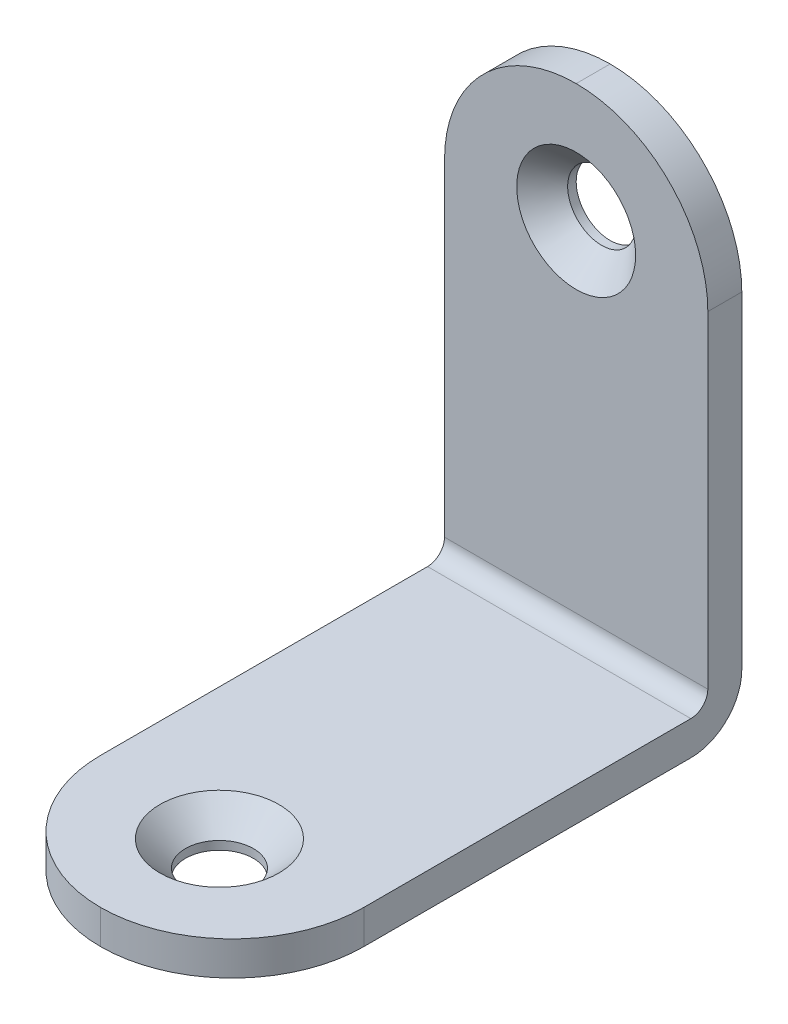
ISO-10303-21;
HEADER;
FILE_DESCRIPTION(('STEP AP214'),'2;1');
FILE_NAME('part.step','',(''),(''),'','','');
FILE_SCHEMA(('AUTOMOTIVE_DESIGN { 1 0 10303 214 1 1 1 1 }'));
ENDSEC;
DATA;
#1=APPLICATION_CONTEXT('core data for automotive mechanical design processes');
#2=APPLICATION_PROTOCOL_DEFINITION('international standard','automotive_design',2000,#1);
#3=PRODUCT_CONTEXT('',#1,'mechanical');
#4=PRODUCT('Part','Part','',(#3));
#5=PRODUCT_RELATED_PRODUCT_CATEGORY('part','',(#4));
#6=PRODUCT_DEFINITION_FORMATION('','',#4);
#7=PRODUCT_DEFINITION_CONTEXT('part definition',#1,'design');
#8=PRODUCT_DEFINITION('design','',#6,#7);
#9=PRODUCT_DEFINITION_SHAPE('','',#8);
#10=(LENGTH_UNIT() NAMED_UNIT(*) SI_UNIT(.MILLI.,.METRE.));
#11=(NAMED_UNIT(*) PLANE_ANGLE_UNIT() SI_UNIT($,.RADIAN.));
#12=(NAMED_UNIT(*) SI_UNIT($,.STERADIAN.) SOLID_ANGLE_UNIT());
#13=UNCERTAINTY_MEASURE_WITH_UNIT(LENGTH_MEASURE(1.E-05),#10,'distance_accuracy_value','');
#14=(GEOMETRIC_REPRESENTATION_CONTEXT(3) GLOBAL_UNCERTAINTY_ASSIGNED_CONTEXT((#13)) GLOBAL_UNIT_ASSIGNED_CONTEXT((#10,
#11,#12)) REPRESENTATION_CONTEXT('',''));
#15=CARTESIAN_POINT('',(0.,0.,0.));
#16=DIRECTION('',(0.,0.,1.));
#17=DIRECTION('',(1.,0.,0.));
#18=AXIS2_PLACEMENT_3D('',#15,#16,#17);
#19=CARTESIAN_POINT('',(-7.75,2.,30.));
#20=DIRECTION('',(0.,1.,0.));
#21=DIRECTION('',(0.,0.,1.));
#22=AXIS2_PLACEMENT_3D('',#19,#20,#21);
#23=PLANE('',#22);
#24=CARTESIAN_POINT('',(0.,2.,23.));
#25=DIRECTION('',(0.,1.,0.));
#26=DIRECTION('',(0.,0.,1.));
#27=AXIS2_PLACEMENT_3D('',#24,#25,#26);
#28=CIRCLE('',#27,3.50000000000001);
#29=CARTESIAN_POINT('',(0.,2.,26.5));
#30=VERTEX_POINT('',#29);
#31=EDGE_CURVE('E11',#30,#30,#28,.F.);
#32=ORIENTED_EDGE('',*,*,#31,.T.);
#33=EDGE_LOOP('',(#32));
#34=FACE_BOUND('',#33,.T.);
#35=CARTESIAN_POINT('',(0.,2.,22.25));
#36=DIRECTION('',(0.,1.,0.));
#37=DIRECTION('',(0.,0.,1.));
#38=AXIS2_PLACEMENT_3D('',#35,#36,#37);
#39=CIRCLE('',#38,7.75);
#40=CARTESIAN_POINT('',(-7.75,2.,22.25));
#41=VERTEX_POINT('',#40);
#42=CARTESIAN_POINT('',(0.,2.,30.));
#43=VERTEX_POINT('',#42);
#44=EDGE_CURVE('E50',#41,#43,#39,.T.);
#45=ORIENTED_EDGE('',*,*,#44,.T.);
#46=CARTESIAN_POINT('',(0.,2.,22.25));
#47=DIRECTION('',(0.,1.,0.));
#48=DIRECTION('',(0.,0.,1.));
#49=AXIS2_PLACEMENT_3D('',#46,#47,#48);
#50=CIRCLE('',#49,7.75);
#51=CARTESIAN_POINT('',(7.75,2.,22.25));
#52=VERTEX_POINT('',#51);
#53=EDGE_CURVE('E192',#43,#52,#50,.T.);
#54=ORIENTED_EDGE('',*,*,#53,.T.);
#55=DIRECTION('',(0.,0.,1.));
#56=VECTOR('',#55,1.);
#57=CARTESIAN_POINT('',(7.75,2.,30.));
#58=LINE('',#57,#56);
#59=CARTESIAN_POINT('',(7.75,2.,3.));
#60=VERTEX_POINT('',#59);
#61=EDGE_CURVE('E146',#60,#52,#58,.T.);
#62=ORIENTED_EDGE('',*,*,#61,.F.);
#63=DIRECTION('',(1.,0.,0.));
#64=VECTOR('',#63,1.);
#65=CARTESIAN_POINT('',(-7.75,2.,3.));
#66=LINE('',#65,#64);
#67=CARTESIAN_POINT('',(-7.75,2.,3.));
#68=VERTEX_POINT('',#67);
#69=EDGE_CURVE('E160',#68,#60,#66,.T.);
#70=ORIENTED_EDGE('',*,*,#69,.F.);
#71=DIRECTION('',(0.,0.,1.));
#72=VECTOR('',#71,1.);
#73=CARTESIAN_POINT('',(-7.75,2.,30.));
#74=LINE('',#73,#72);
#75=EDGE_CURVE('E134',#68,#41,#74,.T.);
#76=ORIENTED_EDGE('',*,*,#75,.T.);
#77=EDGE_LOOP('',(#45,#54,#62,#70,#76));
#78=FACE_BOUND('',#77,.T.);
#79=ADVANCED_FACE('F35',(#34,#78),#23,.T.);
#80=CARTESIAN_POINT('',(-7.75,3.,3.));
#81=DIRECTION('',(1.,0.,0.));
#82=DIRECTION('',(0.,0.,-1.));
#83=AXIS2_PLACEMENT_3D('',#80,#81,#82);
#84=CYLINDRICAL_SURFACE('',#83,1.);
#85=ORIENTED_EDGE('',*,*,#69,.T.);
#86=CARTESIAN_POINT('',(7.75,3.,3.));
#87=DIRECTION('',(-1.,0.,0.));
#88=DIRECTION('',(0.,0.,-1.));
#89=AXIS2_PLACEMENT_3D('',#86,#87,#88);
#90=CIRCLE('',#89,1.);
#91=CARTESIAN_POINT('',(7.75,3.,2.));
#92=VERTEX_POINT('',#91);
#93=EDGE_CURVE('E143',#92,#60,#90,.T.);
#94=ORIENTED_EDGE('',*,*,#93,.F.);
#95=DIRECTION('',(1.,0.,0.));
#96=VECTOR('',#95,1.);
#97=CARTESIAN_POINT('',(-7.75,3.,2.));
#98=LINE('',#97,#96);
#99=CARTESIAN_POINT('',(-7.75,3.,2.));
#100=VERTEX_POINT('',#99);
#101=EDGE_CURVE('E162',#100,#92,#98,.T.);
#102=ORIENTED_EDGE('',*,*,#101,.F.);
#103=CARTESIAN_POINT('',(-7.75,3.,3.));
#104=DIRECTION('',(-1.,0.,0.));
#105=DIRECTION('',(0.,0.,-1.));
#106=AXIS2_PLACEMENT_3D('',#103,#104,#105);
#107=CIRCLE('',#106,1.);
#108=EDGE_CURVE('E156',#100,#68,#107,.T.);
#109=ORIENTED_EDGE('',*,*,#108,.T.);
#110=EDGE_LOOP('',(#85,#94,#102,#109));
#111=FACE_BOUND('',#110,.T.);
#112=ADVANCED_FACE('F220',(#111),#84,.F.);
#113=CARTESIAN_POINT('',(-7.75,3.,2.));
#114=DIRECTION('',(0.,0.,1.));
#115=DIRECTION('',(0.,-1.,0.));
#116=AXIS2_PLACEMENT_3D('',#113,#114,#115);
#117=PLANE('',#116);
#118=CARTESIAN_POINT('',(0.,23.,2.));
#119=DIRECTION('',(0.,0.,1.));
#120=DIRECTION('',(0.,-1.,0.));
#121=AXIS2_PLACEMENT_3D('',#118,#119,#120);
#122=CIRCLE('',#121,3.50000000000001);
#123=CARTESIAN_POINT('',(0.,19.5,2.));
#124=VERTEX_POINT('',#123);
#125=EDGE_CURVE('E202',#124,#124,#122,.F.);
#126=ORIENTED_EDGE('',*,*,#125,.T.);
#127=EDGE_LOOP('',(#126));
#128=FACE_BOUND('',#127,.T.);
#129=DIRECTION('',(0.,-1.,0.));
#130=VECTOR('',#129,1.);
#131=CARTESIAN_POINT('',(7.75,3.,2.));
#132=LINE('',#131,#130);
#133=CARTESIAN_POINT('',(7.75,22.25,2.));
#134=VERTEX_POINT('',#133);
#135=EDGE_CURVE('E139',#134,#92,#132,.T.);
#136=ORIENTED_EDGE('',*,*,#135,.F.);
#137=CARTESIAN_POINT('',(0.,22.25,2.));
#138=DIRECTION('',(0.,0.,1.));
#139=DIRECTION('',(0.,-1.,0.));
#140=AXIS2_PLACEMENT_3D('',#137,#138,#139);
#141=CIRCLE('',#140,7.75);
#142=CARTESIAN_POINT('',(0.,30.,2.));
#143=VERTEX_POINT('',#142);
#144=EDGE_CURVE('E178',#134,#143,#141,.T.);
#145=ORIENTED_EDGE('',*,*,#144,.T.);
#146=CARTESIAN_POINT('',(0.,22.25,2.));
#147=DIRECTION('',(0.,0.,1.));
#148=DIRECTION('',(0.,-1.,0.));
#149=AXIS2_PLACEMENT_3D('',#146,#147,#148);
#150=CIRCLE('',#149,7.75);
#151=CARTESIAN_POINT('',(-7.75,22.25,2.));
#152=VERTEX_POINT('',#151);
#153=EDGE_CURVE('E176',#143,#152,#150,.T.);
#154=ORIENTED_EDGE('',*,*,#153,.T.);
#155=DIRECTION('',(0.,-1.,0.));
#156=VECTOR('',#155,1.);
#157=CARTESIAN_POINT('',(-7.75,3.,2.));
#158=LINE('',#157,#156);
#159=EDGE_CURVE('E154',#152,#100,#158,.T.);
#160=ORIENTED_EDGE('',*,*,#159,.T.);
#161=ORIENTED_EDGE('',*,*,#101,.T.);
#162=EDGE_LOOP('',(#136,#145,#154,#160,#161));
#163=FACE_BOUND('',#162,.T.);
#164=ADVANCED_FACE('F226',(#128,#163),#117,.T.);
#165=CARTESIAN_POINT('',(-7.75,3.,0.));
#166=DIRECTION('',(0.,0.,-1.));
#167=DIRECTION('',(-1.,0.,0.));
#168=AXIS2_PLACEMENT_3D('',#165,#166,#167);
#169=PLANE('',#168);
#170=CARTESIAN_POINT('',(0.,23.,0.));
#171=DIRECTION('',(0.,0.,-1.));
#172=DIRECTION('',(-1.,0.,0.));
#173=AXIS2_PLACEMENT_3D('',#170,#171,#172);
#174=CIRCLE('',#173,2.);
#175=CARTESIAN_POINT('',(-2.,23.,0.));
#176=VERTEX_POINT('',#175);
#177=EDGE_CURVE('E168',#176,#176,#174,.T.);
#178=ORIENTED_EDGE('',*,*,#177,.F.);
#179=EDGE_LOOP('',(#178));
#180=FACE_BOUND('',#179,.T.);
#181=CARTESIAN_POINT('',(0.,22.25,0.));
#182=DIRECTION('',(0.,0.,-1.));
#183=DIRECTION('',(-1.,0.,0.));
#184=AXIS2_PLACEMENT_3D('',#181,#182,#183);
#185=CIRCLE('',#184,7.75);
#186=CARTESIAN_POINT('',(-7.75,22.25,0.));
#187=VERTEX_POINT('',#186);
#188=CARTESIAN_POINT('',(0.,30.,0.));
#189=VERTEX_POINT('',#188);
#190=EDGE_CURVE('E180',#187,#189,#185,.T.);
#191=ORIENTED_EDGE('',*,*,#190,.T.);
#192=CARTESIAN_POINT('',(0.,22.25,0.));
#193=DIRECTION('',(0.,0.,-1.));
#194=DIRECTION('',(-1.,0.,0.));
#195=AXIS2_PLACEMENT_3D('',#192,#193,#194);
#196=CIRCLE('',#195,7.75);
#197=CARTESIAN_POINT('',(7.75,22.25,0.));
#198=VERTEX_POINT('',#197);
#199=EDGE_CURVE('E182',#189,#198,#196,.T.);
#200=ORIENTED_EDGE('',*,*,#199,.T.);
#201=DIRECTION('',(0.,1.,0.));
#202=VECTOR('',#201,1.);
#203=CARTESIAN_POINT('',(7.75,3.,0.));
#204=LINE('',#203,#202);
#205=CARTESIAN_POINT('',(7.75,3.,0.));
#206=VERTEX_POINT('',#205);
#207=EDGE_CURVE('E137',#206,#198,#204,.T.);
#208=ORIENTED_EDGE('',*,*,#207,.F.);
#209=DIRECTION('',(1.,0.,0.));
#210=VECTOR('',#209,1.);
#211=CARTESIAN_POINT('',(-7.75,3.,0.));
#212=LINE('',#211,#210);
#213=CARTESIAN_POINT('',(-7.75,3.,0.));
#214=VERTEX_POINT('',#213);
#215=EDGE_CURVE('E133',#214,#206,#212,.T.);
#216=ORIENTED_EDGE('',*,*,#215,.F.);
#217=DIRECTION('',(0.,1.,0.));
#218=VECTOR('',#217,1.);
#219=CARTESIAN_POINT('',(-7.75,3.,0.));
#220=LINE('',#219,#218);
#221=EDGE_CURVE('E151',#214,#187,#220,.T.);
#222=ORIENTED_EDGE('',*,*,#221,.T.);
#223=EDGE_LOOP('',(#191,#200,#208,#216,#222));
#224=FACE_BOUND('',#223,.T.);
#225=ADVANCED_FACE('F235',(#180,#224),#169,.T.);
#226=CARTESIAN_POINT('',(-7.75,3.,3.));
#227=DIRECTION('',(1.,0.,0.));
#228=DIRECTION('',(0.,0.,-1.));
#229=AXIS2_PLACEMENT_3D('',#226,#227,#228);
#230=CYLINDRICAL_SURFACE('',#229,3.);
#231=ORIENTED_EDGE('',*,*,#215,.T.);
#232=CARTESIAN_POINT('',(7.75,3.,3.));
#233=DIRECTION('',(1.,0.,0.));
#234=DIRECTION('',(0.,0.,-1.));
#235=AXIS2_PLACEMENT_3D('',#232,#233,#234);
#236=CIRCLE('',#235,3.);
#237=CARTESIAN_POINT('',(7.75,0.,3.));
#238=VERTEX_POINT('',#237);
#239=EDGE_CURVE('E118',#238,#206,#236,.T.);
#240=ORIENTED_EDGE('',*,*,#239,.F.);
#241=DIRECTION('',(1.,0.,0.));
#242=VECTOR('',#241,1.);
#243=CARTESIAN_POINT('',(-7.75,0.,3.));
#244=LINE('',#243,#242);
#245=CARTESIAN_POINT('',(-7.75,0.,3.));
#246=VERTEX_POINT('',#245);
#247=EDGE_CURVE('E126',#246,#238,#244,.T.);
#248=ORIENTED_EDGE('',*,*,#247,.F.);
#249=CARTESIAN_POINT('',(-7.75,3.,3.));
#250=DIRECTION('',(1.,0.,0.));
#251=DIRECTION('',(0.,0.,-1.));
#252=AXIS2_PLACEMENT_3D('',#249,#250,#251);
#253=CIRCLE('',#252,3.);
#254=EDGE_CURVE('E149',#246,#214,#253,.T.);
#255=ORIENTED_EDGE('',*,*,#254,.T.);
#256=EDGE_LOOP('',(#231,#240,#248,#255));
#257=FACE_BOUND('',#256,.T.);
#258=ADVANCED_FACE('F136',(#257),#230,.T.);
#259=CARTESIAN_POINT('',(-7.75,0.,30.));
#260=DIRECTION('',(0.,-1.,0.));
#261=DIRECTION('',(0.,0.,-1.));
#262=AXIS2_PLACEMENT_3D('',#259,#260,#261);
#263=PLANE('',#262);
#264=CARTESIAN_POINT('',(0.,0.,23.));
#265=DIRECTION('',(0.,-1.,0.));
#266=DIRECTION('',(0.,0.,-1.));
#267=AXIS2_PLACEMENT_3D('',#264,#265,#266);
#268=CIRCLE('',#267,2.);
#269=CARTESIAN_POINT('',(0.,0.,21.));
#270=VERTEX_POINT('',#269);
#271=EDGE_CURVE('E123',#270,#270,#268,.T.);
#272=ORIENTED_EDGE('',*,*,#271,.F.);
#273=EDGE_LOOP('',(#272));
#274=FACE_BOUND('',#273,.T.);
#275=DIRECTION('',(0.,0.,-1.));
#276=VECTOR('',#275,1.);
#277=CARTESIAN_POINT('',(7.75,0.,30.));
#278=LINE('',#277,#276);
#279=CARTESIAN_POINT('',(7.75,0.,22.25));
#280=VERTEX_POINT('',#279);
#281=EDGE_CURVE('E113',#280,#238,#278,.T.);
#282=ORIENTED_EDGE('',*,*,#281,.F.);
#283=CARTESIAN_POINT('',(0.,0.,22.25));
#284=DIRECTION('',(0.,-1.,0.));
#285=DIRECTION('',(0.,0.,-1.));
#286=AXIS2_PLACEMENT_3D('',#283,#284,#285);
#287=CIRCLE('',#286,7.75);
#288=CARTESIAN_POINT('',(0.,0.,30.));
#289=VERTEX_POINT('',#288);
#290=EDGE_CURVE('E58',#280,#289,#287,.T.);
#291=ORIENTED_EDGE('',*,*,#290,.T.);
#292=CARTESIAN_POINT('',(0.,0.,22.25));
#293=DIRECTION('',(0.,-1.,0.));
#294=DIRECTION('',(0.,0.,-1.));
#295=AXIS2_PLACEMENT_3D('',#292,#293,#294);
#296=CIRCLE('',#295,7.75);
#297=CARTESIAN_POINT('',(-7.75,0.,22.25));
#298=VERTEX_POINT('',#297);
#299=EDGE_CURVE('E188',#289,#298,#296,.T.);
#300=ORIENTED_EDGE('',*,*,#299,.T.);
#301=DIRECTION('',(0.,0.,-1.));
#302=VECTOR('',#301,1.);
#303=CARTESIAN_POINT('',(-7.75,0.,30.));
#304=LINE('',#303,#302);
#305=EDGE_CURVE('E129',#298,#246,#304,.T.);
#306=ORIENTED_EDGE('',*,*,#305,.T.);
#307=ORIENTED_EDGE('',*,*,#247,.T.);
#308=EDGE_LOOP('',(#282,#291,#300,#306,#307));
#309=FACE_BOUND('',#308,.T.);
#310=ADVANCED_FACE('F127',(#274,#309),#263,.T.);
#311=CARTESIAN_POINT('',(-7.75,3.,3.));
#312=DIRECTION('',(1.,0.,0.));
#313=DIRECTION('',(0.,0.,-1.));
#314=AXIS2_PLACEMENT_3D('',#311,#312,#313);
#315=PLANE('',#314);
#316=ORIENTED_EDGE('',*,*,#159,.F.);
#317=DIRECTION('',(0.,0.,1.));
#318=VECTOR('',#317,1.);
#319=CARTESIAN_POINT('',(-7.75,22.25,0.));
#320=LINE('',#319,#318);
#321=EDGE_CURVE('E186',#152,#187,#320,.F.);
#322=ORIENTED_EDGE('',*,*,#321,.T.);
#323=ORIENTED_EDGE('',*,*,#221,.F.);
#324=ORIENTED_EDGE('',*,*,#254,.F.);
#325=ORIENTED_EDGE('',*,*,#305,.F.);
#326=DIRECTION('',(0.,-1.,0.));
#327=VECTOR('',#326,1.);
#328=CARTESIAN_POINT('',(-7.75,2.,22.25));
#329=LINE('',#328,#327);
#330=EDGE_CURVE('E184',#298,#41,#329,.F.);
#331=ORIENTED_EDGE('',*,*,#330,.T.);
#332=ORIENTED_EDGE('',*,*,#75,.F.);
#333=ORIENTED_EDGE('',*,*,#108,.F.);
#334=EDGE_LOOP('',(#316,#322,#323,#324,#325,#331,#332,#333));
#335=FACE_BOUND('',#334,.T.);
#336=ADVANCED_FACE('F230',(#335),#315,.F.);
#337=CARTESIAN_POINT('',(7.75,3.,3.));
#338=DIRECTION('',(1.,0.,0.));
#339=DIRECTION('',(0.,0.,-1.));
#340=AXIS2_PLACEMENT_3D('',#337,#338,#339);
#341=PLANE('',#340);
#342=ORIENTED_EDGE('',*,*,#207,.T.);
#343=DIRECTION('',(0.,0.,1.));
#344=VECTOR('',#343,1.);
#345=CARTESIAN_POINT('',(7.75,22.25,3.));
#346=LINE('',#345,#344);
#347=EDGE_CURVE('E173',#198,#134,#346,.T.);
#348=ORIENTED_EDGE('',*,*,#347,.T.);
#349=ORIENTED_EDGE('',*,*,#135,.T.);
#350=ORIENTED_EDGE('',*,*,#93,.T.);
#351=ORIENTED_EDGE('',*,*,#61,.T.);
#352=DIRECTION('',(0.,-1.,0.));
#353=VECTOR('',#352,1.);
#354=CARTESIAN_POINT('',(7.75,3.,22.25));
#355=LINE('',#354,#353);
#356=EDGE_CURVE('E122',#52,#280,#355,.T.);
#357=ORIENTED_EDGE('',*,*,#356,.T.);
#358=ORIENTED_EDGE('',*,*,#281,.T.);
#359=ORIENTED_EDGE('',*,*,#239,.T.);
#360=EDGE_LOOP('',(#342,#348,#349,#350,#351,#357,#358,#359));
#361=FACE_BOUND('',#360,.T.);
#362=ADVANCED_FACE('F116',(#361),#341,.T.);
#363=CARTESIAN_POINT('',(0.,-13.5,23.));
#364=DIRECTION('',(0.,1.,0.));
#365=DIRECTION('',(0.,0.,1.));
#366=AXIS2_PLACEMENT_3D('',#363,#364,#365);
#367=CYLINDRICAL_SURFACE('',#366,2.);
#368=CARTESIAN_POINT('',(0.,0.499999999999999,23.));
#369=DIRECTION('',(0.,1.,0.));
#370=DIRECTION('',(0.,0.,1.));
#371=AXIS2_PLACEMENT_3D('',#368,#369,#370);
#372=CIRCLE('',#371,2.);
#373=CARTESIAN_POINT('',(0.,0.499999999999999,25.));
#374=VERTEX_POINT('',#373);
#375=EDGE_CURVE('E43',#374,#374,#372,.T.);
#376=ORIENTED_EDGE('',*,*,#375,.T.);
#377=EDGE_LOOP('',(#376));
#378=FACE_BOUND('',#377,.T.);
#379=ORIENTED_EDGE('',*,*,#271,.T.);
#380=EDGE_LOOP('',(#379));
#381=FACE_BOUND('',#380,.T.);
#382=ADVANCED_FACE('F207',(#378,#381),#367,.F.);
#383=CARTESIAN_POINT('',(0.,23.,-13.5));
#384=DIRECTION('',(0.,0.,1.));
#385=DIRECTION('',(1.,0.,0.));
#386=AXIS2_PLACEMENT_3D('',#383,#384,#385);
#387=CYLINDRICAL_SURFACE('',#386,2.);
#388=CARTESIAN_POINT('',(0.,23.,0.499999999999999));
#389=DIRECTION('',(0.,0.,1.));
#390=DIRECTION('',(1.,0.,0.));
#391=AXIS2_PLACEMENT_3D('',#388,#389,#390);
#392=CIRCLE('',#391,2.);
#393=CARTESIAN_POINT('',(2.,23.,0.499999999999999));
#394=VERTEX_POINT('',#393);
#395=EDGE_CURVE('E194',#394,#394,#392,.T.);
#396=ORIENTED_EDGE('',*,*,#395,.T.);
#397=EDGE_LOOP('',(#396));
#398=FACE_BOUND('',#397,.T.);
#399=ORIENTED_EDGE('',*,*,#177,.T.);
#400=EDGE_LOOP('',(#399));
#401=FACE_BOUND('',#400,.T.);
#402=ADVANCED_FACE('F253',(#398,#401),#387,.F.);
#403=CARTESIAN_POINT('',(0.,22.25,0.));
#404=DIRECTION('',(0.,0.,-1.));
#405=DIRECTION('',(-1.,0.,0.));
#406=AXIS2_PLACEMENT_3D('',#403,#404,#405);
#407=CYLINDRICAL_SURFACE('',#406,7.75);
#408=DIRECTION('',(0.,0.,1.));
#409=VECTOR('',#408,1.);
#410=CARTESIAN_POINT('',(0.,30.,2.));
#411=LINE('',#410,#409);
#412=EDGE_CURVE('E171',#189,#143,#411,.T.);
#413=ORIENTED_EDGE('',*,*,#412,.F.);
#414=ORIENTED_EDGE('',*,*,#190,.F.);
#415=ORIENTED_EDGE('',*,*,#321,.F.);
#416=ORIENTED_EDGE('',*,*,#153,.F.);
#417=EDGE_LOOP('',(#413,#414,#415,#416));
#418=FACE_BOUND('',#417,.T.);
#419=ADVANCED_FACE('F249',(#418),#407,.T.);
#420=CARTESIAN_POINT('',(0.,22.25,3.));
#421=DIRECTION('',(0.,0.,1.));
#422=DIRECTION('',(1.,0.,0.));
#423=AXIS2_PLACEMENT_3D('',#420,#421,#422);
#424=CYLINDRICAL_SURFACE('',#423,7.75);
#425=ORIENTED_EDGE('',*,*,#199,.F.);
#426=ORIENTED_EDGE('',*,*,#412,.T.);
#427=ORIENTED_EDGE('',*,*,#144,.F.);
#428=ORIENTED_EDGE('',*,*,#347,.F.);
#429=EDGE_LOOP('',(#425,#426,#427,#428));
#430=FACE_BOUND('',#429,.T.);
#431=ADVANCED_FACE('F245',(#430),#424,.T.);
#432=CARTESIAN_POINT('',(0.,0.,22.25));
#433=DIRECTION('',(0.,1.,0.));
#434=DIRECTION('',(0.,0.,1.));
#435=AXIS2_PLACEMENT_3D('',#432,#433,#434);
#436=CYLINDRICAL_SURFACE('',#435,7.75);
#437=DIRECTION('',(0.,-1.,0.));
#438=VECTOR('',#437,1.);
#439=CARTESIAN_POINT('',(0.,0.,30.));
#440=LINE('',#439,#438);
#441=EDGE_CURVE('E197',#43,#289,#440,.T.);
#442=ORIENTED_EDGE('',*,*,#441,.F.);
#443=ORIENTED_EDGE('',*,*,#44,.F.);
#444=ORIENTED_EDGE('',*,*,#330,.F.);
#445=ORIENTED_EDGE('',*,*,#299,.F.);
#446=EDGE_LOOP('',(#442,#443,#444,#445));
#447=FACE_BOUND('',#446,.T.);
#448=ADVANCED_FACE('F248',(#447),#436,.T.);
#449=CARTESIAN_POINT('',(0.,3.,22.25));
#450=DIRECTION('',(0.,-1.,0.));
#451=DIRECTION('',(0.,0.,-1.));
#452=AXIS2_PLACEMENT_3D('',#449,#450,#451);
#453=CYLINDRICAL_SURFACE('',#452,7.75);
#454=ORIENTED_EDGE('',*,*,#53,.F.);
#455=ORIENTED_EDGE('',*,*,#441,.T.);
#456=ORIENTED_EDGE('',*,*,#290,.F.);
#457=ORIENTED_EDGE('',*,*,#356,.F.);
#458=EDGE_LOOP('',(#454,#455,#456,#457));
#459=FACE_BOUND('',#458,.T.);
#460=ADVANCED_FACE('F216',(#459),#453,.T.);
#461=CARTESIAN_POINT('',(0.,23.,0.499999999999999));
#462=DIRECTION('',(0.,0.,1.));
#463=DIRECTION('',(1.,0.,0.));
#464=AXIS2_PLACEMENT_3D('',#461,#462,#463);
#465=CONICAL_SURFACE('',#464,2.,0.785398163397451);
#466=ORIENTED_EDGE('',*,*,#125,.F.);
#467=EDGE_LOOP('',(#466));
#468=FACE_BOUND('',#467,.T.);
#469=ORIENTED_EDGE('',*,*,#395,.F.);
#470=EDGE_LOOP('',(#469));
#471=FACE_BOUND('',#470,.T.);
#472=ADVANCED_FACE('F211',(#468,#471),#465,.F.);
#473=CARTESIAN_POINT('',(0.,0.499999999999999,23.));
#474=DIRECTION('',(0.,1.,0.));
#475=DIRECTION('',(0.,0.,1.));
#476=AXIS2_PLACEMENT_3D('',#473,#474,#475);
#477=CONICAL_SURFACE('',#476,2.,0.785398163397451);
#478=ORIENTED_EDGE('',*,*,#31,.F.);
#479=EDGE_LOOP('',(#478));
#480=FACE_BOUND('',#479,.T.);
#481=ORIENTED_EDGE('',*,*,#375,.F.);
#482=EDGE_LOOP('',(#481));
#483=FACE_BOUND('',#482,.T.);
#484=ADVANCED_FACE('F37',(#480,#483),#477,.F.);
#485=CLOSED_SHELL('',(#79,#112,#164,#225,#258,#310,#336,#362,#382,#402,#419,#431,#448,#460,#472,#484));
#486=MANIFOLD_SOLID_BREP('B2',#485);
#487=ADVANCED_BREP_SHAPE_REPRESENTATION('',(#18,#486),#14);
#488=SHAPE_DEFINITION_REPRESENTATION(#9,#487);
ENDSEC;
END-ISO-10303-21;
